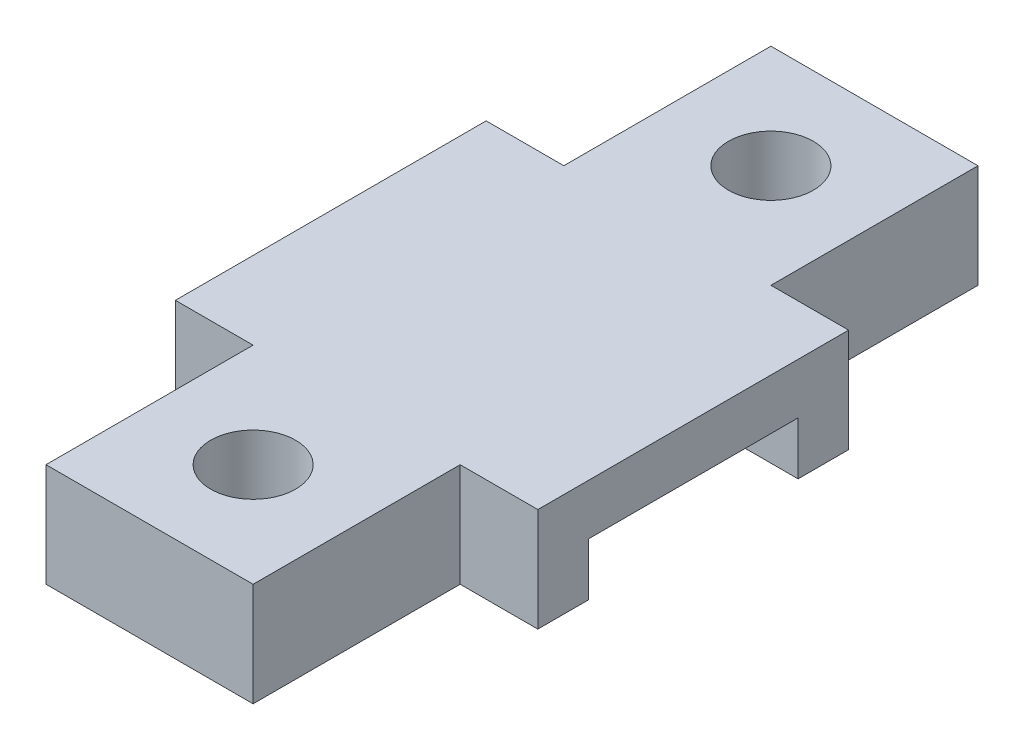
ISO-10303-21;
HEADER;
FILE_DESCRIPTION(('STEP AP214'),'2;1');
FILE_NAME('part.step','',(''),(''),'','','');
FILE_SCHEMA(('AUTOMOTIVE_DESIGN { 1 0 10303 214 1 1 1 1 }'));
ENDSEC;
DATA;
#1=APPLICATION_CONTEXT('core data for automotive mechanical design processes');
#2=APPLICATION_PROTOCOL_DEFINITION('international standard','automotive_design',2000,#1);
#3=PRODUCT_CONTEXT('',#1,'mechanical');
#4=PRODUCT('Part','Part','',(#3));
#5=PRODUCT_RELATED_PRODUCT_CATEGORY('part','',(#4));
#6=PRODUCT_DEFINITION_FORMATION('','',#4);
#7=PRODUCT_DEFINITION_CONTEXT('part definition',#1,'design');
#8=PRODUCT_DEFINITION('design','',#6,#7);
#9=PRODUCT_DEFINITION_SHAPE('','',#8);
#10=(LENGTH_UNIT() NAMED_UNIT(*) SI_UNIT(.MILLI.,.METRE.));
#11=(NAMED_UNIT(*) PLANE_ANGLE_UNIT() SI_UNIT($,.RADIAN.));
#12=(NAMED_UNIT(*) SI_UNIT($,.STERADIAN.) SOLID_ANGLE_UNIT());
#13=UNCERTAINTY_MEASURE_WITH_UNIT(LENGTH_MEASURE(1.E-05),#10,'distance_accuracy_value','');
#14=(GEOMETRIC_REPRESENTATION_CONTEXT(3) GLOBAL_UNCERTAINTY_ASSIGNED_CONTEXT((#13)) GLOBAL_UNIT_ASSIGNED_CONTEXT((#10,
#11,#12)) REPRESENTATION_CONTEXT('',''));
#15=CARTESIAN_POINT('',(0.,0.,0.));
#16=DIRECTION('',(0.,0.,1.));
#17=DIRECTION('',(1.,0.,0.));
#18=AXIS2_PLACEMENT_3D('',#15,#16,#17);
#19=CARTESIAN_POINT('',(-10.,10.,35.));
#20=DIRECTION('',(1.,0.,0.));
#21=DIRECTION('',(0.,0.,-1.));
#22=AXIS2_PLACEMENT_3D('',#19,#20,#21);
#23=PLANE('',#22);
#24=DIRECTION('',(0.,0.,1.));
#25=VECTOR('',#24,1.);
#26=CARTESIAN_POINT('',(-10.,10.,35.));
#27=LINE('',#26,#25);
#28=CARTESIAN_POINT('',(-10.,10.,15.005));
#29=VERTEX_POINT('',#28);
#30=CARTESIAN_POINT('',(-10.,10.,35.));
#31=VERTEX_POINT('',#30);
#32=EDGE_CURVE('E254',#29,#31,#27,.T.);
#33=ORIENTED_EDGE('',*,*,#32,.F.);
#34=DIRECTION('',(0.,-1.,0.));
#35=VECTOR('',#34,1.);
#36=CARTESIAN_POINT('',(-10.,10.,15.005));
#37=LINE('',#36,#35);
#38=CARTESIAN_POINT('',(-10.,0.,15.005));
#39=VERTEX_POINT('',#38);
#40=EDGE_CURVE('E49',#29,#39,#37,.T.);
#41=ORIENTED_EDGE('',*,*,#40,.T.);
#42=DIRECTION('',(0.,0.,1.));
#43=VECTOR('',#42,1.);
#44=CARTESIAN_POINT('',(-10.,0.,35.));
#45=LINE('',#44,#43);
#46=CARTESIAN_POINT('',(-10.,0.,35.));
#47=VERTEX_POINT('',#46);
#48=EDGE_CURVE('E158',#39,#47,#45,.T.);
#49=ORIENTED_EDGE('',*,*,#48,.T.);
#50=DIRECTION('',(0.,-1.,0.));
#51=VECTOR('',#50,1.);
#52=CARTESIAN_POINT('',(-10.,10.,35.));
#53=LINE('',#52,#51);
#54=EDGE_CURVE('E11',#31,#47,#53,.T.);
#55=ORIENTED_EDGE('',*,*,#54,.F.);
#56=EDGE_LOOP('',(#33,#41,#49,#55));
#57=FACE_BOUND('',#56,.T.);
#58=ADVANCED_FACE('F34',(#57),#23,.F.);
#59=CARTESIAN_POINT('',(9.99999999999999,10.,35.));
#60=DIRECTION('',(-1.,0.,0.));
#61=DIRECTION('',(0.,0.,1.));
#62=AXIS2_PLACEMENT_3D('',#59,#60,#61);
#63=PLANE('',#62);
#64=DIRECTION('',(0.,0.,-1.));
#65=VECTOR('',#64,1.);
#66=CARTESIAN_POINT('',(9.99999999999999,0.,35.));
#67=LINE('',#66,#65);
#68=CARTESIAN_POINT('',(9.99999999999999,0.,35.));
#69=VERTEX_POINT('',#68);
#70=CARTESIAN_POINT('',(9.99999999999999,0.,15.005));
#71=VERTEX_POINT('',#70);
#72=EDGE_CURVE('E57',#69,#71,#67,.T.);
#73=ORIENTED_EDGE('',*,*,#72,.T.);
#74=DIRECTION('',(0.,1.,0.));
#75=VECTOR('',#74,1.);
#76=CARTESIAN_POINT('',(9.99999999999999,10.,15.005));
#77=LINE('',#76,#75);
#78=CARTESIAN_POINT('',(9.99999999999999,10.,15.005));
#79=VERTEX_POINT('',#78);
#80=EDGE_CURVE('E230',#71,#79,#77,.T.);
#81=ORIENTED_EDGE('',*,*,#80,.T.);
#82=DIRECTION('',(0.,0.,-1.));
#83=VECTOR('',#82,1.);
#84=CARTESIAN_POINT('',(9.99999999999999,10.,35.));
#85=LINE('',#84,#83);
#86=CARTESIAN_POINT('',(9.99999999999999,10.,35.));
#87=VERTEX_POINT('',#86);
#88=EDGE_CURVE('E257',#87,#79,#85,.T.);
#89=ORIENTED_EDGE('',*,*,#88,.F.);
#90=DIRECTION('',(0.,-1.,0.));
#91=VECTOR('',#90,1.);
#92=CARTESIAN_POINT('',(9.99999999999999,10.,35.));
#93=LINE('',#92,#91);
#94=EDGE_CURVE('E42',#87,#69,#93,.T.);
#95=ORIENTED_EDGE('',*,*,#94,.T.);
#96=EDGE_LOOP('',(#73,#81,#89,#95));
#97=FACE_BOUND('',#96,.T.);
#98=ADVANCED_FACE('F277',(#97),#63,.F.);
#99=CARTESIAN_POINT('',(0.,0.,0.));
#100=DIRECTION('',(0.,1.,0.));
#101=DIRECTION('',(0.,0.,1.));
#102=AXIS2_PLACEMENT_3D('',#99,#100,#101);
#103=PLANE('',#102);
#104=CARTESIAN_POINT('',(0.,0.,25.));
#105=DIRECTION('',(0.,-1.,0.));
#106=DIRECTION('',(0.,0.,-1.));
#107=AXIS2_PLACEMENT_3D('',#104,#105,#106);
#108=CIRCLE('',#107,4.1);
#109=CARTESIAN_POINT('',(0.,0.,20.9));
#110=VERTEX_POINT('',#109);
#111=EDGE_CURVE('E237',#110,#110,#108,.T.);
#112=ORIENTED_EDGE('',*,*,#111,.F.);
#113=EDGE_LOOP('',(#112));
#114=FACE_BOUND('',#113,.T.);
#115=ORIENTED_EDGE('',*,*,#48,.F.);
#116=DIRECTION('',(1.,0.,0.));
#117=VECTOR('',#116,1.);
#118=CARTESIAN_POINT('',(-17.5,0.,15.005));
#119=LINE('',#118,#117);
#120=CARTESIAN_POINT('',(-17.5,0.,15.005));
#121=VERTEX_POINT('',#120);
#122=EDGE_CURVE('E211',#121,#39,#119,.T.);
#123=ORIENTED_EDGE('',*,*,#122,.F.);
#124=DIRECTION('',(0.,0.,-1.));
#125=VECTOR('',#124,1.);
#126=CARTESIAN_POINT('',(-17.5,0.,10.125));
#127=LINE('',#126,#125);
#128=CARTESIAN_POINT('',(-17.5,0.,10.125));
#129=VERTEX_POINT('',#128);
#130=EDGE_CURVE('E207',#121,#129,#127,.T.);
#131=ORIENTED_EDGE('',*,*,#130,.T.);
#132=DIRECTION('',(1.,0.,0.));
#133=VECTOR('',#132,1.);
#134=CARTESIAN_POINT('',(-10.,0.,10.125));
#135=LINE('',#134,#133);
#136=CARTESIAN_POINT('',(17.5,0.,10.125));
#137=VERTEX_POINT('',#136);
#138=EDGE_CURVE('E243',#129,#137,#135,.T.);
#139=ORIENTED_EDGE('',*,*,#138,.T.);
#140=DIRECTION('',(0.,0.,-1.));
#141=VECTOR('',#140,1.);
#142=CARTESIAN_POINT('',(17.5,0.,10.125));
#143=LINE('',#142,#141);
#144=CARTESIAN_POINT('',(17.5,0.,15.005));
#145=VERTEX_POINT('',#144);
#146=EDGE_CURVE('E173',#145,#137,#143,.T.);
#147=ORIENTED_EDGE('',*,*,#146,.F.);
#148=EDGE_CURVE('E215',#71,#145,#119,.T.);
#149=ORIENTED_EDGE('',*,*,#148,.F.);
#150=ORIENTED_EDGE('',*,*,#72,.F.);
#151=DIRECTION('',(1.,0.,0.));
#152=VECTOR('',#151,1.);
#153=CARTESIAN_POINT('',(9.99999999999999,0.,35.));
#154=LINE('',#153,#152);
#155=EDGE_CURVE('E265',#47,#69,#154,.T.);
#156=ORIENTED_EDGE('',*,*,#155,.F.);
#157=EDGE_LOOP('',(#115,#123,#131,#139,#147,#149,#150,#156));
#158=FACE_BOUND('',#157,.T.);
#159=ADVANCED_FACE('F283',(#114,#158),#103,.F.);
#160=CARTESIAN_POINT('',(-10.,0.,-35.));
#161=VERTEX_POINT('',#160);
#162=CARTESIAN_POINT('',(-10.,0.,-15.005));
#163=VERTEX_POINT('',#162);
#164=EDGE_CURVE('E263',#161,#163,#45,.T.);
#165=ORIENTED_EDGE('',*,*,#164,.T.);
#166=DIRECTION('',(0.,1.,0.));
#167=VECTOR('',#166,1.);
#168=CARTESIAN_POINT('',(-10.,10.,-15.005));
#169=LINE('',#168,#167);
#170=CARTESIAN_POINT('',(-10.,10.,-15.005));
#171=VERTEX_POINT('',#170);
#172=EDGE_CURVE('E228',#163,#171,#169,.T.);
#173=ORIENTED_EDGE('',*,*,#172,.T.);
#174=CARTESIAN_POINT('',(-10.,10.,-35.));
#175=VERTEX_POINT('',#174);
#176=EDGE_CURVE('E250',#175,#171,#27,.T.);
#177=ORIENTED_EDGE('',*,*,#176,.F.);
#178=DIRECTION('',(0.,-1.,0.));
#179=VECTOR('',#178,1.);
#180=CARTESIAN_POINT('',(-10.,10.,-35.));
#181=LINE('',#180,#179);
#182=EDGE_CURVE('E262',#175,#161,#181,.T.);
#183=ORIENTED_EDGE('',*,*,#182,.T.);
#184=EDGE_LOOP('',(#165,#173,#177,#183));
#185=FACE_BOUND('',#184,.T.);
#186=ADVANCED_FACE('F36',(#185),#23,.F.);
#187=CARTESIAN_POINT('',(9.99999999999999,10.,35.));
#188=DIRECTION('',(0.,0.,-1.));
#189=DIRECTION('',(-1.,0.,0.));
#190=AXIS2_PLACEMENT_3D('',#187,#188,#189);
#191=PLANE('',#190);
#192=ORIENTED_EDGE('',*,*,#155,.T.);
#193=ORIENTED_EDGE('',*,*,#94,.F.);
#194=DIRECTION('',(1.,0.,0.));
#195=VECTOR('',#194,1.);
#196=CARTESIAN_POINT('',(9.99999999999999,10.,35.));
#197=LINE('',#196,#195);
#198=EDGE_CURVE('E253',#31,#87,#197,.T.);
#199=ORIENTED_EDGE('',*,*,#198,.F.);
#200=ORIENTED_EDGE('',*,*,#54,.T.);
#201=EDGE_LOOP('',(#192,#193,#199,#200));
#202=FACE_BOUND('',#201,.T.);
#203=ADVANCED_FACE('F295',(#202),#191,.F.);
#204=CARTESIAN_POINT('',(9.99999999999999,10.,-15.005));
#205=VERTEX_POINT('',#204);
#206=CARTESIAN_POINT('',(9.99999999999999,10.,-35.));
#207=VERTEX_POINT('',#206);
#208=EDGE_CURVE('E256',#205,#207,#85,.T.);
#209=ORIENTED_EDGE('',*,*,#208,.F.);
#210=DIRECTION('',(0.,-1.,0.));
#211=VECTOR('',#210,1.);
#212=CARTESIAN_POINT('',(9.99999999999999,10.,-15.005));
#213=LINE('',#212,#211);
#214=CARTESIAN_POINT('',(9.99999999999999,0.,-15.005));
#215=VERTEX_POINT('',#214);
#216=EDGE_CURVE('E214',#205,#215,#213,.T.);
#217=ORIENTED_EDGE('',*,*,#216,.T.);
#218=CARTESIAN_POINT('',(9.99999999999999,0.,-35.));
#219=VERTEX_POINT('',#218);
#220=EDGE_CURVE('E267',#215,#219,#67,.T.);
#221=ORIENTED_EDGE('',*,*,#220,.T.);
#222=DIRECTION('',(0.,-1.,0.));
#223=VECTOR('',#222,1.);
#224=CARTESIAN_POINT('',(9.99999999999999,10.,-35.));
#225=LINE('',#224,#223);
#226=EDGE_CURVE('E273',#207,#219,#225,.T.);
#227=ORIENTED_EDGE('',*,*,#226,.F.);
#228=EDGE_LOOP('',(#209,#217,#221,#227));
#229=FACE_BOUND('',#228,.T.);
#230=ADVANCED_FACE('F318',(#229),#63,.F.);
#231=CARTESIAN_POINT('',(9.99999999999999,10.,-35.));
#232=DIRECTION('',(0.,0.,1.));
#233=DIRECTION('',(1.,0.,0.));
#234=AXIS2_PLACEMENT_3D('',#231,#232,#233);
#235=PLANE('',#234);
#236=DIRECTION('',(-1.,0.,0.));
#237=VECTOR('',#236,1.);
#238=CARTESIAN_POINT('',(9.99999999999999,0.,-35.));
#239=LINE('',#238,#237);
#240=EDGE_CURVE('E269',#219,#161,#239,.T.);
#241=ORIENTED_EDGE('',*,*,#240,.T.);
#242=ORIENTED_EDGE('',*,*,#182,.F.);
#243=DIRECTION('',(-1.,0.,0.));
#244=VECTOR('',#243,1.);
#245=CARTESIAN_POINT('',(9.99999999999999,10.,-35.));
#246=LINE('',#245,#244);
#247=EDGE_CURVE('E260',#207,#175,#246,.T.);
#248=ORIENTED_EDGE('',*,*,#247,.F.);
#249=ORIENTED_EDGE('',*,*,#226,.T.);
#250=EDGE_LOOP('',(#241,#242,#248,#249));
#251=FACE_BOUND('',#250,.T.);
#252=ADVANCED_FACE('F324',(#251),#235,.F.);
#253=CARTESIAN_POINT('',(0.,10.,0.));
#254=DIRECTION('',(0.,1.,0.));
#255=DIRECTION('',(0.,0.,1.));
#256=AXIS2_PLACEMENT_3D('',#253,#254,#255);
#257=PLANE('',#256);
#258=ORIENTED_EDGE('',*,*,#176,.T.);
#259=DIRECTION('',(1.,0.,0.));
#260=VECTOR('',#259,1.);
#261=CARTESIAN_POINT('',(-17.5,10.,-15.005));
#262=LINE('',#261,#260);
#263=CARTESIAN_POINT('',(-17.5,10.,-15.005));
#264=VERTEX_POINT('',#263);
#265=EDGE_CURVE('E220',#264,#171,#262,.T.);
#266=ORIENTED_EDGE('',*,*,#265,.F.);
#267=DIRECTION('',(0.,0.,1.));
#268=VECTOR('',#267,1.);
#269=CARTESIAN_POINT('',(-17.5,10.,15.005));
#270=LINE('',#269,#268);
#271=CARTESIAN_POINT('',(-17.5,10.,15.005));
#272=VERTEX_POINT('',#271);
#273=EDGE_CURVE('E201',#264,#272,#270,.T.);
#274=ORIENTED_EDGE('',*,*,#273,.T.);
#275=DIRECTION('',(1.,0.,0.));
#276=VECTOR('',#275,1.);
#277=CARTESIAN_POINT('',(-17.5,10.,15.005));
#278=LINE('',#277,#276);
#279=EDGE_CURVE('E216',#272,#29,#278,.T.);
#280=ORIENTED_EDGE('',*,*,#279,.T.);
#281=ORIENTED_EDGE('',*,*,#32,.T.);
#282=ORIENTED_EDGE('',*,*,#198,.T.);
#283=ORIENTED_EDGE('',*,*,#88,.T.);
#284=CARTESIAN_POINT('',(17.5,10.,15.005));
#285=VERTEX_POINT('',#284);
#286=EDGE_CURVE('E219',#79,#285,#278,.T.);
#287=ORIENTED_EDGE('',*,*,#286,.T.);
#288=DIRECTION('',(0.,0.,1.));
#289=VECTOR('',#288,1.);
#290=CARTESIAN_POINT('',(17.5,10.,15.005));
#291=LINE('',#290,#289);
#292=CARTESIAN_POINT('',(17.5,10.,-15.005));
#293=VERTEX_POINT('',#292);
#294=EDGE_CURVE('E183',#293,#285,#291,.T.);
#295=ORIENTED_EDGE('',*,*,#294,.F.);
#296=EDGE_CURVE('E223',#205,#293,#262,.T.);
#297=ORIENTED_EDGE('',*,*,#296,.F.);
#298=ORIENTED_EDGE('',*,*,#208,.T.);
#299=ORIENTED_EDGE('',*,*,#247,.T.);
#300=EDGE_LOOP('',(#258,#266,#274,#280,#281,#282,#283,#287,#295,#297,#298,#299));
#301=FACE_BOUND('',#300,.T.);
#302=CARTESIAN_POINT('',(0.,10.,-25.));
#303=DIRECTION('',(0.,-1.,0.));
#304=DIRECTION('',(0.,0.,-1.));
#305=AXIS2_PLACEMENT_3D('',#302,#303,#304);
#306=CIRCLE('',#305,4.1);
#307=CARTESIAN_POINT('',(0.,10.,-29.1));
#308=VERTEX_POINT('',#307);
#309=EDGE_CURVE('E234',#308,#308,#306,.T.);
#310=ORIENTED_EDGE('',*,*,#309,.T.);
#311=EDGE_LOOP('',(#310));
#312=FACE_BOUND('',#311,.T.);
#313=CARTESIAN_POINT('',(0.,10.,25.));
#314=DIRECTION('',(0.,-1.,0.));
#315=DIRECTION('',(0.,0.,-1.));
#316=AXIS2_PLACEMENT_3D('',#313,#314,#315);
#317=CIRCLE('',#316,4.1);
#318=CARTESIAN_POINT('',(0.,10.,20.9));
#319=VERTEX_POINT('',#318);
#320=EDGE_CURVE('E240',#319,#319,#317,.T.);
#321=ORIENTED_EDGE('',*,*,#320,.T.);
#322=EDGE_LOOP('',(#321));
#323=FACE_BOUND('',#322,.T.);
#324=ADVANCED_FACE('F292',(#301,#312,#323),#257,.T.);
#325=CARTESIAN_POINT('',(0.,0.,-25.));
#326=DIRECTION('',(0.,-1.,0.));
#327=DIRECTION('',(0.,0.,-1.));
#328=AXIS2_PLACEMENT_3D('',#325,#326,#327);
#329=CIRCLE('',#328,4.1);
#330=CARTESIAN_POINT('',(0.,0.,-29.1));
#331=VERTEX_POINT('',#330);
#332=EDGE_CURVE('E233',#331,#331,#329,.T.);
#333=ORIENTED_EDGE('',*,*,#332,.F.);
#334=EDGE_LOOP('',(#333));
#335=FACE_BOUND('',#334,.T.);
#336=ORIENTED_EDGE('',*,*,#220,.F.);
#337=DIRECTION('',(1.,0.,0.));
#338=VECTOR('',#337,1.);
#339=CARTESIAN_POINT('',(-17.5,0.,-15.005));
#340=LINE('',#339,#338);
#341=CARTESIAN_POINT('',(17.5,0.,-15.005));
#342=VERTEX_POINT('',#341);
#343=EDGE_CURVE('E210',#215,#342,#340,.T.);
#344=ORIENTED_EDGE('',*,*,#343,.T.);
#345=DIRECTION('',(0.,0.,-1.));
#346=VECTOR('',#345,1.);
#347=CARTESIAN_POINT('',(17.5,0.,-15.005));
#348=LINE('',#347,#346);
#349=CARTESIAN_POINT('',(17.5,0.,-10.125));
#350=VERTEX_POINT('',#349);
#351=EDGE_CURVE('E177',#350,#342,#348,.T.);
#352=ORIENTED_EDGE('',*,*,#351,.F.);
#353=DIRECTION('',(1.,0.,0.));
#354=VECTOR('',#353,1.);
#355=CARTESIAN_POINT('',(-10.,0.,-10.125));
#356=LINE('',#355,#354);
#357=CARTESIAN_POINT('',(-17.5,0.,-10.125));
#358=VERTEX_POINT('',#357);
#359=EDGE_CURVE('E247',#358,#350,#356,.T.);
#360=ORIENTED_EDGE('',*,*,#359,.F.);
#361=DIRECTION('',(0.,0.,-1.));
#362=VECTOR('',#361,1.);
#363=CARTESIAN_POINT('',(-17.5,0.,-15.005));
#364=LINE('',#363,#362);
#365=CARTESIAN_POINT('',(-17.5,0.,-15.005));
#366=VERTEX_POINT('',#365);
#367=EDGE_CURVE('E195',#358,#366,#364,.T.);
#368=ORIENTED_EDGE('',*,*,#367,.T.);
#369=EDGE_CURVE('E224',#366,#163,#340,.T.);
#370=ORIENTED_EDGE('',*,*,#369,.T.);
#371=ORIENTED_EDGE('',*,*,#164,.F.);
#372=ORIENTED_EDGE('',*,*,#240,.F.);
#373=EDGE_LOOP('',(#336,#344,#352,#360,#368,#370,#371,#372));
#374=FACE_BOUND('',#373,.T.);
#375=ADVANCED_FACE('F311',(#335,#374),#103,.F.);
#376=CARTESIAN_POINT('',(-10.,5.10000000000001,-10.125));
#377=DIRECTION('',(0.,1.,0.));
#378=DIRECTION('',(0.,0.,1.));
#379=AXIS2_PLACEMENT_3D('',#376,#377,#378);
#380=PLANE('',#379);
#381=DIRECTION('',(1.,0.,0.));
#382=VECTOR('',#381,1.);
#383=CARTESIAN_POINT('',(-10.,5.1,10.125));
#384=LINE('',#383,#382);
#385=CARTESIAN_POINT('',(-17.5,5.1,10.125));
#386=VERTEX_POINT('',#385);
#387=CARTESIAN_POINT('',(17.5,5.1,10.125));
#388=VERTEX_POINT('',#387);
#389=EDGE_CURVE('E148',#386,#388,#384,.T.);
#390=ORIENTED_EDGE('',*,*,#389,.F.);
#391=DIRECTION('',(0.,0.,-1.));
#392=VECTOR('',#391,1.);
#393=CARTESIAN_POINT('',(-17.5,5.10000000000001,-10.125));
#394=LINE('',#393,#392);
#395=CARTESIAN_POINT('',(-17.5,5.10000000000001,-10.125));
#396=VERTEX_POINT('',#395);
#397=EDGE_CURVE('E190',#386,#396,#394,.T.);
#398=ORIENTED_EDGE('',*,*,#397,.T.);
#399=DIRECTION('',(1.,0.,0.));
#400=VECTOR('',#399,1.);
#401=CARTESIAN_POINT('',(-10.,5.10000000000001,-10.125));
#402=LINE('',#401,#400);
#403=CARTESIAN_POINT('',(17.5,5.10000000000001,-10.125));
#404=VERTEX_POINT('',#403);
#405=EDGE_CURVE('E159',#396,#404,#402,.T.);
#406=ORIENTED_EDGE('',*,*,#405,.T.);
#407=DIRECTION('',(0.,0.,-1.));
#408=VECTOR('',#407,1.);
#409=CARTESIAN_POINT('',(17.5,5.10000000000001,-10.125));
#410=LINE('',#409,#408);
#411=EDGE_CURVE('E162',#388,#404,#410,.T.);
#412=ORIENTED_EDGE('',*,*,#411,.F.);
#413=EDGE_LOOP('',(#390,#398,#406,#412));
#414=FACE_BOUND('',#413,.T.);
#415=ADVANCED_FACE('F163',(#414),#380,.F.);
#416=CARTESIAN_POINT('',(-10.,5.1,10.125));
#417=DIRECTION('',(0.,0.,1.));
#418=DIRECTION('',(1.,0.,0.));
#419=AXIS2_PLACEMENT_3D('',#416,#417,#418);
#420=PLANE('',#419);
#421=ORIENTED_EDGE('',*,*,#138,.F.);
#422=DIRECTION('',(0.,1.,0.));
#423=VECTOR('',#422,1.);
#424=CARTESIAN_POINT('',(-17.5,5.1,10.125));
#425=LINE('',#424,#423);
#426=EDGE_CURVE('E154',#129,#386,#425,.T.);
#427=ORIENTED_EDGE('',*,*,#426,.T.);
#428=ORIENTED_EDGE('',*,*,#389,.T.);
#429=DIRECTION('',(0.,1.,0.));
#430=VECTOR('',#429,1.);
#431=CARTESIAN_POINT('',(17.5,5.1,10.125));
#432=LINE('',#431,#430);
#433=EDGE_CURVE('E152',#137,#388,#432,.T.);
#434=ORIENTED_EDGE('',*,*,#433,.F.);
#435=EDGE_LOOP('',(#421,#427,#428,#434));
#436=FACE_BOUND('',#435,.T.);
#437=ADVANCED_FACE('F150',(#436),#420,.F.);
#438=CARTESIAN_POINT('',(-10.,5.10000000000001,-10.125));
#439=DIRECTION('',(0.,0.,-1.));
#440=DIRECTION('',(0.,1.,0.));
#441=AXIS2_PLACEMENT_3D('',#438,#439,#440);
#442=PLANE('',#441);
#443=ORIENTED_EDGE('',*,*,#405,.F.);
#444=DIRECTION('',(0.,-1.,0.));
#445=VECTOR('',#444,1.);
#446=CARTESIAN_POINT('',(-17.5,0.,-10.125));
#447=LINE('',#446,#445);
#448=EDGE_CURVE('E192',#396,#358,#447,.T.);
#449=ORIENTED_EDGE('',*,*,#448,.T.);
#450=ORIENTED_EDGE('',*,*,#359,.T.);
#451=DIRECTION('',(0.,-1.,0.));
#452=VECTOR('',#451,1.);
#453=CARTESIAN_POINT('',(17.5,0.,-10.125));
#454=LINE('',#453,#452);
#455=EDGE_CURVE('E167',#404,#350,#454,.T.);
#456=ORIENTED_EDGE('',*,*,#455,.F.);
#457=EDGE_LOOP('',(#443,#449,#450,#456));
#458=FACE_BOUND('',#457,.T.);
#459=ADVANCED_FACE('F307',(#458),#442,.F.);
#460=CARTESIAN_POINT('',(0.,10.,25.));
#461=DIRECTION('',(0.,-1.,0.));
#462=DIRECTION('',(0.,0.,-1.));
#463=AXIS2_PLACEMENT_3D('',#460,#461,#462);
#464=CYLINDRICAL_SURFACE('',#463,4.1);
#465=ORIENTED_EDGE('',*,*,#320,.F.);
#466=EDGE_LOOP('',(#465));
#467=FACE_BOUND('',#466,.T.);
#468=ORIENTED_EDGE('',*,*,#111,.T.);
#469=EDGE_LOOP('',(#468));
#470=FACE_BOUND('',#469,.T.);
#471=ADVANCED_FACE('F368',(#467,#470),#464,.F.);
#472=CARTESIAN_POINT('',(0.,10.,-25.));
#473=DIRECTION('',(0.,-1.,0.));
#474=DIRECTION('',(0.,0.,-1.));
#475=AXIS2_PLACEMENT_3D('',#472,#473,#474);
#476=CYLINDRICAL_SURFACE('',#475,4.1);
#477=ORIENTED_EDGE('',*,*,#309,.F.);
#478=EDGE_LOOP('',(#477));
#479=FACE_BOUND('',#478,.T.);
#480=ORIENTED_EDGE('',*,*,#332,.T.);
#481=EDGE_LOOP('',(#480));
#482=FACE_BOUND('',#481,.T.);
#483=ADVANCED_FACE('F366',(#479,#482),#476,.F.);
#484=CARTESIAN_POINT('',(17.5,0.,0.));
#485=DIRECTION('',(-1.,0.,0.));
#486=DIRECTION('',(0.,0.,1.));
#487=AXIS2_PLACEMENT_3D('',#484,#485,#486);
#488=PLANE('',#487);
#489=ORIENTED_EDGE('',*,*,#433,.T.);
#490=ORIENTED_EDGE('',*,*,#411,.T.);
#491=ORIENTED_EDGE('',*,*,#455,.T.);
#492=ORIENTED_EDGE('',*,*,#351,.T.);
#493=DIRECTION('',(0.,1.,0.));
#494=VECTOR('',#493,1.);
#495=CARTESIAN_POINT('',(17.5,10.,-15.005));
#496=LINE('',#495,#494);
#497=EDGE_CURVE('E180',#342,#293,#496,.T.);
#498=ORIENTED_EDGE('',*,*,#497,.T.);
#499=ORIENTED_EDGE('',*,*,#294,.T.);
#500=DIRECTION('',(0.,-1.,0.));
#501=VECTOR('',#500,1.);
#502=CARTESIAN_POINT('',(17.5,0.,15.005));
#503=LINE('',#502,#501);
#504=EDGE_CURVE('E186',#285,#145,#503,.T.);
#505=ORIENTED_EDGE('',*,*,#504,.T.);
#506=ORIENTED_EDGE('',*,*,#146,.T.);
#507=EDGE_LOOP('',(#489,#490,#491,#492,#498,#499,#505,#506));
#508=FACE_BOUND('',#507,.T.);
#509=ADVANCED_FACE('F170',(#508),#488,.F.);
#510=CARTESIAN_POINT('',(-17.5,10.,-15.005));
#511=DIRECTION('',(0.,0.,-1.));
#512=DIRECTION('',(-1.,0.,0.));
#513=AXIS2_PLACEMENT_3D('',#510,#511,#512);
#514=PLANE('',#513);
#515=ORIENTED_EDGE('',*,*,#216,.F.);
#516=ORIENTED_EDGE('',*,*,#296,.T.);
#517=ORIENTED_EDGE('',*,*,#497,.F.);
#518=ORIENTED_EDGE('',*,*,#343,.F.);
#519=EDGE_LOOP('',(#515,#516,#517,#518));
#520=FACE_BOUND('',#519,.T.);
#521=ADVANCED_FACE('F316',(#520),#514,.T.);
#522=CARTESIAN_POINT('',(-17.5,0.,15.005));
#523=DIRECTION('',(0.,0.,1.));
#524=DIRECTION('',(1.,0.,0.));
#525=AXIS2_PLACEMENT_3D('',#522,#523,#524);
#526=PLANE('',#525);
#527=ORIENTED_EDGE('',*,*,#80,.F.);
#528=ORIENTED_EDGE('',*,*,#148,.T.);
#529=ORIENTED_EDGE('',*,*,#504,.F.);
#530=ORIENTED_EDGE('',*,*,#286,.F.);
#531=EDGE_LOOP('',(#527,#528,#529,#530));
#532=FACE_BOUND('',#531,.T.);
#533=ADVANCED_FACE('F286',(#532),#526,.T.);
#534=ORIENTED_EDGE('',*,*,#40,.F.);
#535=ORIENTED_EDGE('',*,*,#279,.F.);
#536=DIRECTION('',(0.,-1.,0.));
#537=VECTOR('',#536,1.);
#538=CARTESIAN_POINT('',(-17.5,0.,15.005));
#539=LINE('',#538,#537);
#540=EDGE_CURVE('E204',#272,#121,#539,.T.);
#541=ORIENTED_EDGE('',*,*,#540,.T.);
#542=ORIENTED_EDGE('',*,*,#122,.T.);
#543=EDGE_LOOP('',(#534,#535,#541,#542));
#544=FACE_BOUND('',#543,.T.);
#545=ADVANCED_FACE('F297',(#544),#526,.T.);
#546=ORIENTED_EDGE('',*,*,#172,.F.);
#547=ORIENTED_EDGE('',*,*,#369,.F.);
#548=DIRECTION('',(0.,1.,0.));
#549=VECTOR('',#548,1.);
#550=CARTESIAN_POINT('',(-17.5,10.,-15.005));
#551=LINE('',#550,#549);
#552=EDGE_CURVE('E198',#366,#264,#551,.T.);
#553=ORIENTED_EDGE('',*,*,#552,.T.);
#554=ORIENTED_EDGE('',*,*,#265,.T.);
#555=EDGE_LOOP('',(#546,#547,#553,#554));
#556=FACE_BOUND('',#555,.T.);
#557=ADVANCED_FACE('F329',(#556),#514,.T.);
#558=CARTESIAN_POINT('',(-17.5,0.,0.));
#559=DIRECTION('',(-1.,0.,0.));
#560=DIRECTION('',(0.,0.,1.));
#561=AXIS2_PLACEMENT_3D('',#558,#559,#560);
#562=PLANE('',#561);
#563=ORIENTED_EDGE('',*,*,#426,.F.);
#564=ORIENTED_EDGE('',*,*,#130,.F.);
#565=ORIENTED_EDGE('',*,*,#540,.F.);
#566=ORIENTED_EDGE('',*,*,#273,.F.);
#567=ORIENTED_EDGE('',*,*,#552,.F.);
#568=ORIENTED_EDGE('',*,*,#367,.F.);
#569=ORIENTED_EDGE('',*,*,#448,.F.);
#570=ORIENTED_EDGE('',*,*,#397,.F.);
#571=EDGE_LOOP('',(#563,#564,#565,#566,#567,#568,#569,#570));
#572=FACE_BOUND('',#571,.T.);
#573=ADVANCED_FACE('F302',(#572),#562,.T.);
#574=CLOSED_SHELL('',(#58,#98,#159,#186,#203,#230,#252,#324,#375,#415,#437,#459,#471,#483,#509,
#521,#533,#545,#557,#573));
#575=MANIFOLD_SOLID_BREP('B2',#574);
#576=ADVANCED_BREP_SHAPE_REPRESENTATION('',(#18,#575),#14);
#577=SHAPE_DEFINITION_REPRESENTATION(#9,#576);
ENDSEC;
END-ISO-10303-21;
